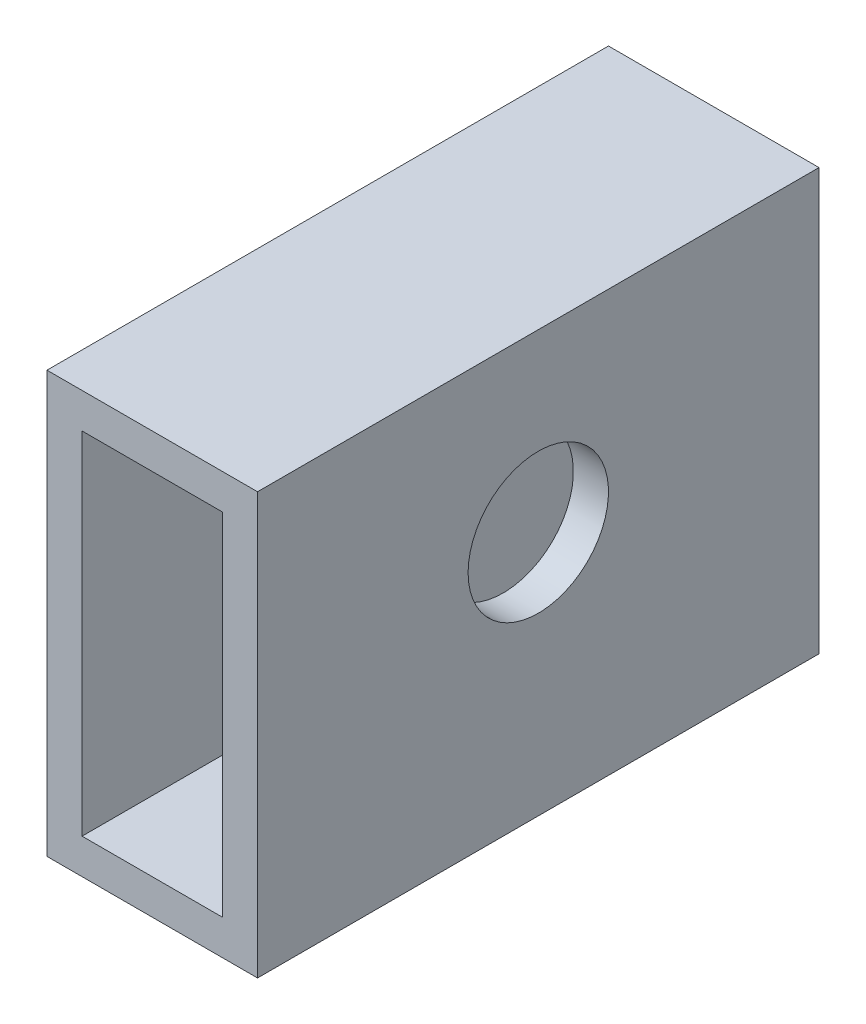
ISO-10303-21;
HEADER;
FILE_DESCRIPTION(('STEP AP214'),'2;1');
FILE_NAME('part.step','',(''),(''),'','','');
FILE_SCHEMA(('AUTOMOTIVE_DESIGN { 1 0 10303 214 1 1 1 1 }'));
ENDSEC;
DATA;
#1=APPLICATION_CONTEXT('core data for automotive mechanical design processes');
#2=APPLICATION_PROTOCOL_DEFINITION('international standard','automotive_design',2000,#1);
#3=PRODUCT_CONTEXT('',#1,'mechanical');
#4=PRODUCT('Part','Part','',(#3));
#5=PRODUCT_RELATED_PRODUCT_CATEGORY('part','',(#4));
#6=PRODUCT_DEFINITION_FORMATION('','',#4);
#7=PRODUCT_DEFINITION_CONTEXT('part definition',#1,'design');
#8=PRODUCT_DEFINITION('design','',#6,#7);
#9=PRODUCT_DEFINITION_SHAPE('','',#8);
#10=(LENGTH_UNIT() NAMED_UNIT(*) SI_UNIT(.MILLI.,.METRE.));
#11=(NAMED_UNIT(*) PLANE_ANGLE_UNIT() SI_UNIT($,.RADIAN.));
#12=(NAMED_UNIT(*) SI_UNIT($,.STERADIAN.) SOLID_ANGLE_UNIT());
#13=UNCERTAINTY_MEASURE_WITH_UNIT(LENGTH_MEASURE(1.E-05),#10,'distance_accuracy_value','');
#14=(GEOMETRIC_REPRESENTATION_CONTEXT(3) GLOBAL_UNCERTAINTY_ASSIGNED_CONTEXT((#13)) GLOBAL_UNIT_ASSIGNED_CONTEXT((#10,
#11,#12)) REPRESENTATION_CONTEXT('',''));
#15=CARTESIAN_POINT('',(0.,0.,0.));
#16=DIRECTION('',(0.,0.,1.));
#17=DIRECTION('',(1.,0.,0.));
#18=AXIS2_PLACEMENT_3D('',#15,#16,#17);
#19=CARTESIAN_POINT('',(0.,0.,50.8));
#20=DIRECTION('',(0.,0.,1.));
#21=DIRECTION('',(1.,0.,0.));
#22=AXIS2_PLACEMENT_3D('',#19,#20,#21);
#23=PLANE('',#22);
#24=DIRECTION('',(0.,-1.,0.));
#25=VECTOR('',#24,1.);
#26=CARTESIAN_POINT('',(0.,0.,50.8));
#27=LINE('',#26,#25);
#28=CARTESIAN_POINT('',(0.,38.1,50.8));
#29=VERTEX_POINT('',#28);
#30=CARTESIAN_POINT('',(0.,0.,50.8));
#31=VERTEX_POINT('',#30);
#32=EDGE_CURVE('E161',#29,#31,#27,.T.);
#33=ORIENTED_EDGE('',*,*,#32,.T.);
#34=DIRECTION('',(1.,0.,0.));
#35=VECTOR('',#34,1.);
#36=CARTESIAN_POINT('',(0.,0.,50.8));
#37=LINE('',#36,#35);
#38=CARTESIAN_POINT('',(19.05,0.,50.8));
#39=VERTEX_POINT('',#38);
#40=EDGE_CURVE('E164',#31,#39,#37,.T.);
#41=ORIENTED_EDGE('',*,*,#40,.T.);
#42=DIRECTION('',(0.,1.,0.));
#43=VECTOR('',#42,1.);
#44=CARTESIAN_POINT('',(19.05,0.,50.8));
#45=LINE('',#44,#43);
#46=CARTESIAN_POINT('',(19.05,38.1,50.8));
#47=VERTEX_POINT('',#46);
#48=EDGE_CURVE('E167',#39,#47,#45,.T.);
#49=ORIENTED_EDGE('',*,*,#48,.T.);
#50=DIRECTION('',(-1.,0.,0.));
#51=VECTOR('',#50,1.);
#52=CARTESIAN_POINT('',(0.,38.1,50.8));
#53=LINE('',#52,#51);
#54=EDGE_CURVE('E169',#47,#29,#53,.T.);
#55=ORIENTED_EDGE('',*,*,#54,.T.);
#56=EDGE_LOOP('',(#33,#41,#49,#55));
#57=FACE_BOUND('',#56,.T.);
#58=DIRECTION('',(1.,0.,0.));
#59=VECTOR('',#58,1.);
#60=CARTESIAN_POINT('',(0.,3.175,50.8));
#61=LINE('',#60,#59);
#62=CARTESIAN_POINT('',(3.175,3.175,50.8));
#63=VERTEX_POINT('',#62);
#64=CARTESIAN_POINT('',(15.875,3.175,50.8));
#65=VERTEX_POINT('',#64);
#66=EDGE_CURVE('E131',#63,#65,#61,.T.);
#67=ORIENTED_EDGE('',*,*,#66,.F.);
#68=DIRECTION('',(0.,-1.,0.));
#69=VECTOR('',#68,1.);
#70=CARTESIAN_POINT('',(3.175,0.,50.8));
#71=LINE('',#70,#69);
#72=CARTESIAN_POINT('',(3.175,34.925,50.8));
#73=VERTEX_POINT('',#72);
#74=EDGE_CURVE('E123',#73,#63,#71,.T.);
#75=ORIENTED_EDGE('',*,*,#74,.F.);
#76=DIRECTION('',(-1.,0.,0.));
#77=VECTOR('',#76,1.);
#78=CARTESIAN_POINT('',(0.,34.925,50.8));
#79=LINE('',#78,#77);
#80=CARTESIAN_POINT('',(15.875,34.925,50.8));
#81=VERTEX_POINT('',#80);
#82=EDGE_CURVE('E145',#81,#73,#79,.T.);
#83=ORIENTED_EDGE('',*,*,#82,.F.);
#84=DIRECTION('',(0.,1.,0.));
#85=VECTOR('',#84,1.);
#86=CARTESIAN_POINT('',(15.875,0.,50.8));
#87=LINE('',#86,#85);
#88=EDGE_CURVE('E143',#65,#81,#87,.T.);
#89=ORIENTED_EDGE('',*,*,#88,.F.);
#90=EDGE_LOOP('',(#67,#75,#83,#89));
#91=FACE_BOUND('',#90,.T.);
#92=ADVANCED_FACE('F57',(#57,#91),#23,.T.);
#93=CARTESIAN_POINT('',(0.,0.,0.));
#94=DIRECTION('',(0.,0.,1.));
#95=DIRECTION('',(1.,0.,0.));
#96=AXIS2_PLACEMENT_3D('',#93,#94,#95);
#97=PLANE('',#96);
#98=DIRECTION('',(0.,-1.,0.));
#99=VECTOR('',#98,1.);
#100=CARTESIAN_POINT('',(0.,0.,0.));
#101=LINE('',#100,#99);
#102=CARTESIAN_POINT('',(0.,38.1,0.));
#103=VERTEX_POINT('',#102);
#104=CARTESIAN_POINT('',(0.,0.,0.));
#105=VERTEX_POINT('',#104);
#106=EDGE_CURVE('E139',#103,#105,#101,.T.);
#107=ORIENTED_EDGE('',*,*,#106,.F.);
#108=DIRECTION('',(-1.,0.,0.));
#109=VECTOR('',#108,1.);
#110=CARTESIAN_POINT('',(0.,38.1,0.));
#111=LINE('',#110,#109);
#112=CARTESIAN_POINT('',(19.05,38.1,0.));
#113=VERTEX_POINT('',#112);
#114=EDGE_CURVE('E165',#113,#103,#111,.T.);
#115=ORIENTED_EDGE('',*,*,#114,.F.);
#116=DIRECTION('',(0.,1.,0.));
#117=VECTOR('',#116,1.);
#118=CARTESIAN_POINT('',(19.05,0.,0.));
#119=LINE('',#118,#117);
#120=CARTESIAN_POINT('',(19.05,0.,0.));
#121=VERTEX_POINT('',#120);
#122=EDGE_CURVE('E176',#121,#113,#119,.T.);
#123=ORIENTED_EDGE('',*,*,#122,.F.);
#124=DIRECTION('',(1.,0.,0.));
#125=VECTOR('',#124,1.);
#126=CARTESIAN_POINT('',(0.,0.,0.));
#127=LINE('',#126,#125);
#128=EDGE_CURVE('E174',#105,#121,#127,.T.);
#129=ORIENTED_EDGE('',*,*,#128,.F.);
#130=EDGE_LOOP('',(#107,#115,#123,#129));
#131=FACE_BOUND('',#130,.T.);
#132=DIRECTION('',(0.,-1.,0.));
#133=VECTOR('',#132,1.);
#134=CARTESIAN_POINT('',(3.175,0.,0.));
#135=LINE('',#134,#133);
#136=CARTESIAN_POINT('',(3.175,34.925,0.));
#137=VERTEX_POINT('',#136);
#138=CARTESIAN_POINT('',(3.175,3.175,0.));
#139=VERTEX_POINT('',#138);
#140=EDGE_CURVE('E81',#137,#139,#135,.T.);
#141=ORIENTED_EDGE('',*,*,#140,.T.);
#142=DIRECTION('',(1.,0.,0.));
#143=VECTOR('',#142,1.);
#144=CARTESIAN_POINT('',(0.,3.175,0.));
#145=LINE('',#144,#143);
#146=CARTESIAN_POINT('',(15.875,3.175,0.));
#147=VERTEX_POINT('',#146);
#148=EDGE_CURVE('E138',#139,#147,#145,.T.);
#149=ORIENTED_EDGE('',*,*,#148,.T.);
#150=DIRECTION('',(0.,1.,0.));
#151=VECTOR('',#150,1.);
#152=CARTESIAN_POINT('',(15.875,0.,0.));
#153=LINE('',#152,#151);
#154=CARTESIAN_POINT('',(15.875,34.925,0.));
#155=VERTEX_POINT('',#154);
#156=EDGE_CURVE('E153',#147,#155,#153,.T.);
#157=ORIENTED_EDGE('',*,*,#156,.T.);
#158=DIRECTION('',(-1.,0.,0.));
#159=VECTOR('',#158,1.);
#160=CARTESIAN_POINT('',(0.,34.925,0.));
#161=LINE('',#160,#159);
#162=EDGE_CURVE('E132',#155,#137,#161,.T.);
#163=ORIENTED_EDGE('',*,*,#162,.T.);
#164=EDGE_LOOP('',(#141,#149,#157,#163));
#165=FACE_BOUND('',#164,.T.);
#166=ADVANCED_FACE('F195',(#131,#165),#97,.F.);
#167=CARTESIAN_POINT('',(0.,0.,50.8));
#168=DIRECTION('',(1.,0.,0.));
#169=DIRECTION('',(0.,0.,-1.));
#170=AXIS2_PLACEMENT_3D('',#167,#168,#169);
#171=PLANE('',#170);
#172=CARTESIAN_POINT('',(0.,22.225,25.4));
#173=DIRECTION('',(-1.,0.,0.));
#174=DIRECTION('',(0.,0.,1.));
#175=AXIS2_PLACEMENT_3D('',#172,#173,#174);
#176=CIRCLE('',#175,6.35);
#177=CARTESIAN_POINT('',(0.,22.225,31.75));
#178=VERTEX_POINT('',#177);
#179=EDGE_CURVE('E238',#178,#178,#176,.T.);
#180=ORIENTED_EDGE('',*,*,#179,.F.);
#181=EDGE_LOOP('',(#180));
#182=FACE_BOUND('',#181,.T.);
#183=ORIENTED_EDGE('',*,*,#106,.T.);
#184=DIRECTION('',(0.,0.,-1.));
#185=VECTOR('',#184,1.);
#186=CARTESIAN_POINT('',(0.,0.,50.8));
#187=LINE('',#186,#185);
#188=EDGE_CURVE('E12',#31,#105,#187,.T.);
#189=ORIENTED_EDGE('',*,*,#188,.F.);
#190=ORIENTED_EDGE('',*,*,#32,.F.);
#191=DIRECTION('',(0.,0.,-1.));
#192=VECTOR('',#191,1.);
#193=CARTESIAN_POINT('',(0.,38.1,50.8));
#194=LINE('',#193,#192);
#195=EDGE_CURVE('E171',#29,#103,#194,.T.);
#196=ORIENTED_EDGE('',*,*,#195,.T.);
#197=EDGE_LOOP('',(#183,#189,#190,#196));
#198=FACE_BOUND('',#197,.T.);
#199=ADVANCED_FACE('F59',(#182,#198),#171,.F.);
#200=CARTESIAN_POINT('',(0.,0.,50.8));
#201=DIRECTION('',(0.,1.,0.));
#202=DIRECTION('',(0.,0.,1.));
#203=AXIS2_PLACEMENT_3D('',#200,#201,#202);
#204=PLANE('',#203);
#205=ORIENTED_EDGE('',*,*,#128,.T.);
#206=DIRECTION('',(0.,0.,-1.));
#207=VECTOR('',#206,1.);
#208=CARTESIAN_POINT('',(19.05,0.,50.8));
#209=LINE('',#208,#207);
#210=EDGE_CURVE('E66',#39,#121,#209,.T.);
#211=ORIENTED_EDGE('',*,*,#210,.F.);
#212=ORIENTED_EDGE('',*,*,#40,.F.);
#213=ORIENTED_EDGE('',*,*,#188,.T.);
#214=EDGE_LOOP('',(#205,#211,#212,#213));
#215=FACE_BOUND('',#214,.T.);
#216=ADVANCED_FACE('F205',(#215),#204,.F.);
#217=CARTESIAN_POINT('',(19.05,0.,50.8));
#218=DIRECTION('',(-1.,0.,0.));
#219=DIRECTION('',(0.,0.,1.));
#220=AXIS2_PLACEMENT_3D('',#217,#218,#219);
#221=PLANE('',#220);
#222=CARTESIAN_POINT('',(19.05,22.225,25.4));
#223=DIRECTION('',(-1.,0.,0.));
#224=DIRECTION('',(0.,0.,1.));
#225=AXIS2_PLACEMENT_3D('',#222,#223,#224);
#226=CIRCLE('',#225,6.35);
#227=CARTESIAN_POINT('',(19.05,22.225,31.75));
#228=VERTEX_POINT('',#227);
#229=EDGE_CURVE('E236',#228,#228,#226,.T.);
#230=ORIENTED_EDGE('',*,*,#229,.T.);
#231=EDGE_LOOP('',(#230));
#232=FACE_BOUND('',#231,.T.);
#233=ORIENTED_EDGE('',*,*,#122,.T.);
#234=DIRECTION('',(0.,0.,-1.));
#235=VECTOR('',#234,1.);
#236=CARTESIAN_POINT('',(19.05,38.1,50.8));
#237=LINE('',#236,#235);
#238=EDGE_CURVE('E181',#47,#113,#237,.T.);
#239=ORIENTED_EDGE('',*,*,#238,.F.);
#240=ORIENTED_EDGE('',*,*,#48,.F.);
#241=ORIENTED_EDGE('',*,*,#210,.T.);
#242=EDGE_LOOP('',(#233,#239,#240,#241));
#243=FACE_BOUND('',#242,.T.);
#244=ADVANCED_FACE('F189',(#232,#243),#221,.F.);
#245=CARTESIAN_POINT('',(0.,38.1,50.8));
#246=DIRECTION('',(0.,-1.,0.));
#247=DIRECTION('',(0.,0.,-1.));
#248=AXIS2_PLACEMENT_3D('',#245,#246,#247);
#249=PLANE('',#248);
#250=ORIENTED_EDGE('',*,*,#114,.T.);
#251=ORIENTED_EDGE('',*,*,#195,.F.);
#252=ORIENTED_EDGE('',*,*,#54,.F.);
#253=ORIENTED_EDGE('',*,*,#238,.T.);
#254=EDGE_LOOP('',(#250,#251,#252,#253));
#255=FACE_BOUND('',#254,.T.);
#256=ADVANCED_FACE('F199',(#255),#249,.F.);
#257=CARTESIAN_POINT('',(3.175,0.,50.8));
#258=DIRECTION('',(1.,0.,0.));
#259=DIRECTION('',(0.,0.,-1.));
#260=AXIS2_PLACEMENT_3D('',#257,#258,#259);
#261=PLANE('',#260);
#262=CARTESIAN_POINT('',(3.175,22.225,25.4));
#263=DIRECTION('',(1.,0.,0.));
#264=DIRECTION('',(0.,0.,-1.));
#265=AXIS2_PLACEMENT_3D('',#262,#263,#264);
#266=CIRCLE('',#265,6.35);
#267=CARTESIAN_POINT('',(3.175,22.225,31.75));
#268=VERTEX_POINT('',#267);
#269=EDGE_CURVE('E151',#268,#268,#266,.T.);
#270=ORIENTED_EDGE('',*,*,#269,.F.);
#271=EDGE_LOOP('',(#270));
#272=FACE_BOUND('',#271,.T.);
#273=ORIENTED_EDGE('',*,*,#140,.F.);
#274=DIRECTION('',(0.,0.,-1.));
#275=VECTOR('',#274,1.);
#276=CARTESIAN_POINT('',(3.175,34.925,50.8));
#277=LINE('',#276,#275);
#278=EDGE_CURVE('E127',#73,#137,#277,.T.);
#279=ORIENTED_EDGE('',*,*,#278,.F.);
#280=ORIENTED_EDGE('',*,*,#74,.T.);
#281=DIRECTION('',(0.,0.,-1.));
#282=VECTOR('',#281,1.);
#283=CARTESIAN_POINT('',(3.175,3.175,50.8));
#284=LINE('',#283,#282);
#285=EDGE_CURVE('E126',#63,#139,#284,.T.);
#286=ORIENTED_EDGE('',*,*,#285,.T.);
#287=EDGE_LOOP('',(#273,#279,#280,#286));
#288=FACE_BOUND('',#287,.T.);
#289=ADVANCED_FACE('F125',(#272,#288),#261,.T.);
#290=CARTESIAN_POINT('',(0.,3.175,50.8));
#291=DIRECTION('',(0.,1.,0.));
#292=DIRECTION('',(0.,0.,1.));
#293=AXIS2_PLACEMENT_3D('',#290,#291,#292);
#294=PLANE('',#293);
#295=ORIENTED_EDGE('',*,*,#148,.F.);
#296=ORIENTED_EDGE('',*,*,#285,.F.);
#297=ORIENTED_EDGE('',*,*,#66,.T.);
#298=DIRECTION('',(0.,0.,-1.));
#299=VECTOR('',#298,1.);
#300=CARTESIAN_POINT('',(15.875,3.175,50.8));
#301=LINE('',#300,#299);
#302=EDGE_CURVE('E140',#65,#147,#301,.T.);
#303=ORIENTED_EDGE('',*,*,#302,.T.);
#304=EDGE_LOOP('',(#295,#296,#297,#303));
#305=FACE_BOUND('',#304,.T.);
#306=ADVANCED_FACE('F135',(#305),#294,.T.);
#307=CARTESIAN_POINT('',(15.875,0.,50.8));
#308=DIRECTION('',(-1.,0.,0.));
#309=DIRECTION('',(0.,0.,1.));
#310=AXIS2_PLACEMENT_3D('',#307,#308,#309);
#311=PLANE('',#310);
#312=CARTESIAN_POINT('',(15.875,22.225,25.4));
#313=DIRECTION('',(-1.,0.,0.));
#314=DIRECTION('',(0.,0.,1.));
#315=AXIS2_PLACEMENT_3D('',#312,#313,#314);
#316=CIRCLE('',#315,6.35);
#317=CARTESIAN_POINT('',(15.875,22.225,31.75));
#318=VERTEX_POINT('',#317);
#319=EDGE_CURVE('E61',#318,#318,#316,.T.);
#320=ORIENTED_EDGE('',*,*,#319,.F.);
#321=EDGE_LOOP('',(#320));
#322=FACE_BOUND('',#321,.T.);
#323=ORIENTED_EDGE('',*,*,#156,.F.);
#324=ORIENTED_EDGE('',*,*,#302,.F.);
#325=ORIENTED_EDGE('',*,*,#88,.T.);
#326=DIRECTION('',(0.,0.,-1.));
#327=VECTOR('',#326,1.);
#328=CARTESIAN_POINT('',(15.875,34.925,50.8));
#329=LINE('',#328,#327);
#330=EDGE_CURVE('E73',#81,#155,#329,.T.);
#331=ORIENTED_EDGE('',*,*,#330,.T.);
#332=EDGE_LOOP('',(#323,#324,#325,#331));
#333=FACE_BOUND('',#332,.T.);
#334=ADVANCED_FACE('F231',(#322,#333),#311,.T.);
#335=CARTESIAN_POINT('',(0.,34.925,50.8));
#336=DIRECTION('',(0.,-1.,0.));
#337=DIRECTION('',(0.,0.,-1.));
#338=AXIS2_PLACEMENT_3D('',#335,#336,#337);
#339=PLANE('',#338);
#340=ORIENTED_EDGE('',*,*,#162,.F.);
#341=ORIENTED_EDGE('',*,*,#330,.F.);
#342=ORIENTED_EDGE('',*,*,#82,.T.);
#343=ORIENTED_EDGE('',*,*,#278,.T.);
#344=EDGE_LOOP('',(#340,#341,#342,#343));
#345=FACE_BOUND('',#344,.T.);
#346=ADVANCED_FACE('F247',(#345),#339,.T.);
#347=CARTESIAN_POINT('',(19.05,22.225,25.4));
#348=DIRECTION('',(-1.,0.,0.));
#349=DIRECTION('',(0.,0.,1.));
#350=AXIS2_PLACEMENT_3D('',#347,#348,#349);
#351=CYLINDRICAL_SURFACE('',#350,6.35);
#352=CARTESIAN_POINT('',(15.875,22.225,31.75));
#353=CARTESIAN_POINT('',(15.9080729166667,22.225,31.75));
#354=CARTESIAN_POINT('',(15.9411458333333,22.225,31.75));
#355=CARTESIAN_POINT('',(16.0072916666667,22.225,31.75));
#356=CARTESIAN_POINT('',(16.0403645833333,22.225,31.75));
#357=CARTESIAN_POINT('',(16.1065104166667,22.225,31.75));
#358=CARTESIAN_POINT('',(16.1395833333333,22.225,31.75));
#359=CARTESIAN_POINT('',(16.2057291666667,22.225,31.75));
#360=CARTESIAN_POINT('',(16.2388020833333,22.225,31.75));
#361=CARTESIAN_POINT('',(16.3049479166667,22.225,31.75));
#362=CARTESIAN_POINT('',(16.3380208333333,22.225,31.75));
#363=CARTESIAN_POINT('',(16.4041666666667,22.225,31.75));
#364=CARTESIAN_POINT('',(16.4372395833333,22.225,31.75));
#365=CARTESIAN_POINT('',(16.5033854166667,22.225,31.75));
#366=CARTESIAN_POINT('',(16.5364583333333,22.225,31.75));
#367=CARTESIAN_POINT('',(16.6026041666667,22.225,31.75));
#368=CARTESIAN_POINT('',(16.6356770833333,22.225,31.75));
#369=CARTESIAN_POINT('',(16.7018229166667,22.225,31.75));
#370=CARTESIAN_POINT('',(16.7348958333333,22.225,31.75));
#371=CARTESIAN_POINT('',(16.8010416666667,22.225,31.75));
#372=CARTESIAN_POINT('',(16.8341145833333,22.225,31.75));
#373=CARTESIAN_POINT('',(16.9002604166667,22.225,31.75));
#374=CARTESIAN_POINT('',(16.9333333333333,22.225,31.75));
#375=CARTESIAN_POINT('',(16.9994791666667,22.225,31.75));
#376=CARTESIAN_POINT('',(17.0325520833333,22.225,31.75));
#377=CARTESIAN_POINT('',(17.0986979166667,22.225,31.75));
#378=CARTESIAN_POINT('',(17.1317708333333,22.225,31.75));
#379=CARTESIAN_POINT('',(17.1979166666667,22.225,31.75));
#380=CARTESIAN_POINT('',(17.2309895833333,22.225,31.75));
#381=CARTESIAN_POINT('',(17.2971354166667,22.225,31.75));
#382=CARTESIAN_POINT('',(17.3302083333333,22.225,31.75));
#383=CARTESIAN_POINT('',(17.3963541666667,22.225,31.75));
#384=CARTESIAN_POINT('',(17.4294270833333,22.225,31.75));
#385=CARTESIAN_POINT('',(17.4955729166667,22.225,31.75));
#386=CARTESIAN_POINT('',(17.5286458333333,22.225,31.75));
#387=CARTESIAN_POINT('',(17.5947916666667,22.225,31.75));
#388=CARTESIAN_POINT('',(17.6278645833333,22.225,31.75));
#389=CARTESIAN_POINT('',(17.6940104166667,22.225,31.75));
#390=CARTESIAN_POINT('',(17.7270833333333,22.225,31.75));
#391=CARTESIAN_POINT('',(17.7932291666667,22.225,31.75));
#392=CARTESIAN_POINT('',(17.8263020833333,22.225,31.75));
#393=CARTESIAN_POINT('',(17.8924479166667,22.225,31.75));
#394=CARTESIAN_POINT('',(17.9255208333333,22.225,31.75));
#395=CARTESIAN_POINT('',(17.9916666666667,22.225,31.75));
#396=CARTESIAN_POINT('',(18.0247395833333,22.225,31.75));
#397=CARTESIAN_POINT('',(18.0908854166667,22.225,31.75));
#398=CARTESIAN_POINT('',(18.1239583333333,22.225,31.75));
#399=CARTESIAN_POINT('',(18.1901041666667,22.225,31.75));
#400=CARTESIAN_POINT('',(18.2231770833333,22.225,31.75));
#401=CARTESIAN_POINT('',(18.2893229166667,22.225,31.75));
#402=CARTESIAN_POINT('',(18.3223958333333,22.225,31.75));
#403=CARTESIAN_POINT('',(18.3885416666667,22.225,31.75));
#404=CARTESIAN_POINT('',(18.4216145833333,22.225,31.75));
#405=CARTESIAN_POINT('',(18.4877604166667,22.225,31.75));
#406=CARTESIAN_POINT('',(18.5208333333333,22.225,31.75));
#407=CARTESIAN_POINT('',(18.5869791666667,22.225,31.75));
#408=CARTESIAN_POINT('',(18.6200520833333,22.225,31.75));
#409=CARTESIAN_POINT('',(18.6861979166667,22.225,31.75));
#410=CARTESIAN_POINT('',(18.7192708333333,22.225,31.75));
#411=CARTESIAN_POINT('',(18.7854166666667,22.225,31.75));
#412=CARTESIAN_POINT('',(18.8184895833333,22.225,31.75));
#413=CARTESIAN_POINT('',(18.8846354166667,22.225,31.75));
#414=CARTESIAN_POINT('',(18.9177083333333,22.225,31.75));
#415=CARTESIAN_POINT('',(18.9838541666667,22.225,31.75));
#416=CARTESIAN_POINT('',(19.0169270833333,22.225,31.75));
#417=CARTESIAN_POINT('',(19.05,22.225,31.75));
#418=B_SPLINE_CURVE_WITH_KNOTS('',3,(#352,#353,#354,#355,#356,#357,#358,#359,#360,#361,#362,
#363,#364,#365,#366,#367,#368,#369,#370,#371,#372,#373,#374,#375,#376,#377,#378,#379,#380,#381,
#382,#383,#384,#385,#386,#387,#388,#389,#390,#391,#392,#393,#394,#395,#396,#397,#398,#399,#400,
#401,#402,#403,#404,#405,#406,#407,#408,#409,#410,#411,#412,#413,#414,#415,#416,#417),
.UNSPECIFIED.,.F.,.F.,(4,2,2,2,2,2,2,2,2,2,2,2,2,2,2,2,2,2,2,2,2,2,2,2,2,2,2,2,2,2,2,2,4),(0.,
0.0992187499999977,0.198437499999999,0.29765625,0.396874999999998,0.496093749999999,0.5953125,
0.694531249999998,0.793749999999999,0.892968749999997,0.992187499999998,1.09140625,1.190625,
1.28984375,1.3890625,1.48828125,1.5875,1.68671875,1.7859375,1.88515625,1.984375,2.08359375,
2.1828125,2.28203125,2.38125,2.48046875,2.5796875,2.67890625,2.778125,2.87734375,2.9765625,
3.07578125,3.175),.UNSPECIFIED.);
#419=EDGE_CURVE('BSEAM244',#318,#228,#418,.T.);
#420=ORIENTED_EDGE('',*,*,#319,.T.);
#421=ORIENTED_EDGE('',*,*,#229,.F.);
#422=ORIENTED_EDGE('',*,*,#419,.T.);
#423=ORIENTED_EDGE('',*,*,#419,.F.);
#424=EDGE_LOOP('',(#420,#422,#421,#423));
#425=FACE_BOUND('',#424,.T.);
#426=ADVANCED_FACE('F244',(#425),#351,.F.);
#427=CARTESIAN_POINT('',(3.175,22.225,31.75));
#428=CARTESIAN_POINT('',(3.14192708333333,22.225,31.75));
#429=CARTESIAN_POINT('',(3.10885416666666,22.225,31.75));
#430=CARTESIAN_POINT('',(3.04270833333333,22.225,31.75));
#431=CARTESIAN_POINT('',(3.00963541666666,22.225,31.75));
#432=CARTESIAN_POINT('',(2.94348958333333,22.225,31.75));
#433=CARTESIAN_POINT('',(2.91041666666666,22.225,31.75));
#434=CARTESIAN_POINT('',(2.84427083333333,22.225,31.75));
#435=CARTESIAN_POINT('',(2.81119791666667,22.225,31.75));
#436=CARTESIAN_POINT('',(2.74505208333333,22.225,31.75));
#437=CARTESIAN_POINT('',(2.71197916666667,22.225,31.75));
#438=CARTESIAN_POINT('',(2.64583333333333,22.225,31.75));
#439=CARTESIAN_POINT('',(2.61276041666666,22.225,31.75));
#440=CARTESIAN_POINT('',(2.54661458333333,22.225,31.75));
#441=CARTESIAN_POINT('',(2.51354166666667,22.225,31.75));
#442=CARTESIAN_POINT('',(2.44739583333333,22.225,31.75));
#443=CARTESIAN_POINT('',(2.41432291666667,22.225,31.75));
#444=CARTESIAN_POINT('',(2.34817708333333,22.225,31.75));
#445=CARTESIAN_POINT('',(2.31510416666666,22.225,31.75));
#446=CARTESIAN_POINT('',(2.24895833333333,22.225,31.75));
#447=CARTESIAN_POINT('',(2.21588541666666,22.225,31.75));
#448=CARTESIAN_POINT('',(2.14973958333333,22.225,31.75));
#449=CARTESIAN_POINT('',(2.11666666666666,22.225,31.75));
#450=CARTESIAN_POINT('',(2.05052083333333,22.225,31.75));
#451=CARTESIAN_POINT('',(2.01744791666666,22.225,31.75));
#452=CARTESIAN_POINT('',(1.95130208333333,22.225,31.75));
#453=CARTESIAN_POINT('',(1.91822916666666,22.225,31.75));
#454=CARTESIAN_POINT('',(1.85208333333333,22.225,31.75));
#455=CARTESIAN_POINT('',(1.81901041666666,22.225,31.75));
#456=CARTESIAN_POINT('',(1.75286458333333,22.225,31.75));
#457=CARTESIAN_POINT('',(1.71979166666667,22.225,31.75));
#458=CARTESIAN_POINT('',(1.65364583333333,22.225,31.75));
#459=CARTESIAN_POINT('',(1.62057291666667,22.225,31.75));
#460=CARTESIAN_POINT('',(1.55442708333333,22.225,31.75));
#461=CARTESIAN_POINT('',(1.52135416666666,22.225,31.75));
#462=CARTESIAN_POINT('',(1.45520833333333,22.225,31.75));
#463=CARTESIAN_POINT('',(1.42213541666667,22.225,31.75));
#464=CARTESIAN_POINT('',(1.35598958333333,22.225,31.75));
#465=CARTESIAN_POINT('',(1.32291666666667,22.225,31.75));
#466=CARTESIAN_POINT('',(1.25677083333333,22.225,31.75));
#467=CARTESIAN_POINT('',(1.22369791666667,22.225,31.75));
#468=CARTESIAN_POINT('',(1.15755208333333,22.225,31.75));
#469=CARTESIAN_POINT('',(1.12447916666667,22.225,31.75));
#470=CARTESIAN_POINT('',(1.05833333333333,22.225,31.75));
#471=CARTESIAN_POINT('',(1.02526041666667,22.225,31.75));
#472=CARTESIAN_POINT('',(0.959114583333332,22.225,31.75));
#473=CARTESIAN_POINT('',(0.926041666666666,22.225,31.75));
#474=CARTESIAN_POINT('',(0.859895833333334,22.225,31.75));
#475=CARTESIAN_POINT('',(0.826822916666666,22.225,31.75));
#476=CARTESIAN_POINT('',(0.760677083333332,22.225,31.75));
#477=CARTESIAN_POINT('',(0.727604166666665,22.225,31.75));
#478=CARTESIAN_POINT('',(0.661458333333332,22.225,31.75));
#479=CARTESIAN_POINT('',(0.628385416666666,22.225,31.75));
#480=CARTESIAN_POINT('',(0.562239583333333,22.225,31.75));
#481=CARTESIAN_POINT('',(0.529166666666666,22.225,31.75));
#482=CARTESIAN_POINT('',(0.463020833333332,22.225,31.75));
#483=CARTESIAN_POINT('',(0.429947916666665,22.225,31.75));
#484=CARTESIAN_POINT('',(0.363802083333332,22.225,31.75));
#485=CARTESIAN_POINT('',(0.330729166666666,22.225,31.75));
#486=CARTESIAN_POINT('',(0.264583333333333,22.225,31.75));
#487=CARTESIAN_POINT('',(0.231510416666666,22.225,31.75));
#488=CARTESIAN_POINT('',(0.165364583333333,22.225,31.75));
#489=CARTESIAN_POINT('',(0.132291666666667,22.225,31.75));
#490=CARTESIAN_POINT('',(0.0661458333333342,22.225,31.75));
#491=CARTESIAN_POINT('',(0.0330729166666671,22.225,31.75));
#492=CARTESIAN_POINT('',(0.,22.225,31.75));
#493=B_SPLINE_CURVE_WITH_KNOTS('',3,(#427,#428,#429,#430,#431,#432,#433,#434,#435,#436,#437,
#438,#439,#440,#441,#442,#443,#444,#445,#446,#447,#448,#449,#450,#451,#452,#453,#454,#455,#456,
#457,#458,#459,#460,#461,#462,#463,#464,#465,#466,#467,#468,#469,#470,#471,#472,#473,#474,#475,
#476,#477,#478,#479,#480,#481,#482,#483,#484,#485,#486,#487,#488,#489,#490,#491,#492),
.UNSPECIFIED.,.F.,.F.,(4,2,2,2,2,2,2,2,2,2,2,2,2,2,2,2,2,2,2,2,2,2,2,2,2,2,2,2,2,2,2,2,4),(0.,
0.0992187500000012,0.198437499999999,0.29765625,0.396874999999998,0.496093749999999,0.5953125,
0.694531249999998,0.793749999999999,0.892968750000001,0.992187499999998,1.09140625,1.190625,
1.28984375,1.3890625,1.48828125,1.5875,1.68671875,1.7859375,1.88515625,1.984375,2.08359375,
2.1828125,2.28203125,2.38125,2.48046875,2.5796875,2.67890625,2.778125,2.87734375,2.9765625,
3.07578125,3.175),.UNSPECIFIED.);
#494=EDGE_CURVE('BSEAM246',#268,#178,#493,.T.);
#495=ORIENTED_EDGE('',*,*,#269,.T.);
#496=ORIENTED_EDGE('',*,*,#179,.T.);
#497=ORIENTED_EDGE('',*,*,#494,.T.);
#498=ORIENTED_EDGE('',*,*,#494,.F.);
#499=EDGE_LOOP('',(#495,#497,#496,#498));
#500=FACE_BOUND('',#499,.T.);
#501=ADVANCED_FACE('F246',(#500),#351,.F.);
#502=CLOSED_SHELL('',(#92,#166,#199,#216,#244,#256,#289,#306,#334,#346,#426,#501));
#503=MANIFOLD_SOLID_BREP('B2',#502);
#504=ADVANCED_BREP_SHAPE_REPRESENTATION('',(#18,#503),#14);
#505=SHAPE_DEFINITION_REPRESENTATION(#9,#504);
ENDSEC;
END-ISO-10303-21;
